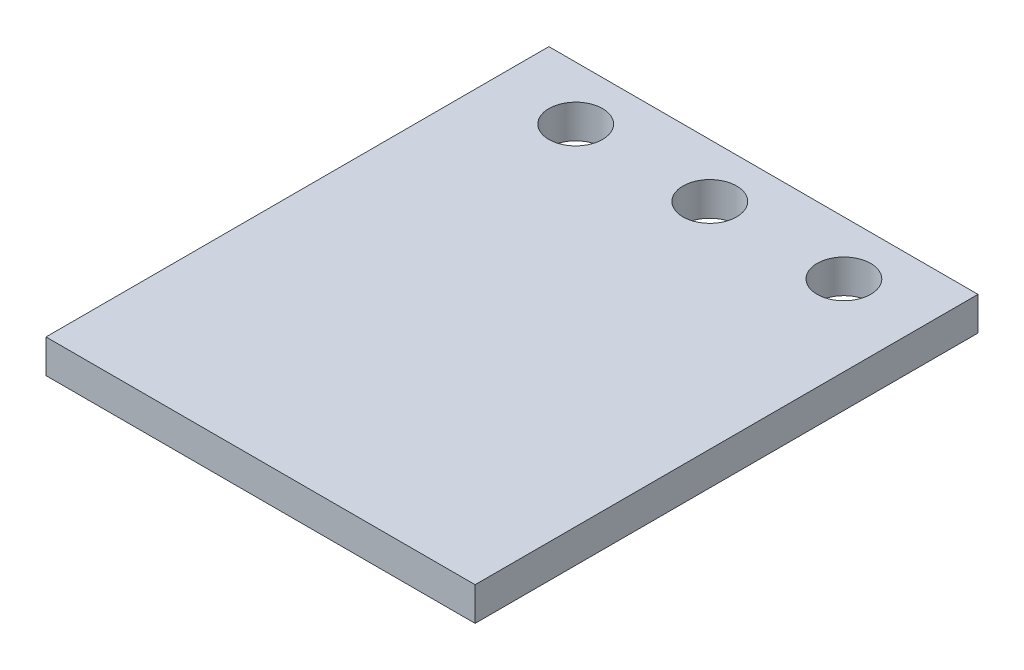
ISO-10303-21;
HEADER;
FILE_DESCRIPTION(('STEP AP214'),'2;1');
FILE_NAME('part.step','',(''),(''),'','','');
FILE_SCHEMA(('AUTOMOTIVE_DESIGN { 1 0 10303 214 1 1 1 1 }'));
ENDSEC;
DATA;
#1=APPLICATION_CONTEXT('core data for automotive mechanical design processes');
#2=APPLICATION_PROTOCOL_DEFINITION('international standard','automotive_design',2000,#1);
#3=PRODUCT_CONTEXT('',#1,'mechanical');
#4=PRODUCT('Part','Part','',(#3));
#5=PRODUCT_RELATED_PRODUCT_CATEGORY('part','',(#4));
#6=PRODUCT_DEFINITION_FORMATION('','',#4);
#7=PRODUCT_DEFINITION_CONTEXT('part definition',#1,'design');
#8=PRODUCT_DEFINITION('design','',#6,#7);
#9=PRODUCT_DEFINITION_SHAPE('','',#8);
#10=(LENGTH_UNIT() NAMED_UNIT(*) SI_UNIT(.MILLI.,.METRE.));
#11=(NAMED_UNIT(*) PLANE_ANGLE_UNIT() SI_UNIT($,.RADIAN.));
#12=(NAMED_UNIT(*) SI_UNIT($,.STERADIAN.) SOLID_ANGLE_UNIT());
#13=UNCERTAINTY_MEASURE_WITH_UNIT(LENGTH_MEASURE(1.E-05),#10,'distance_accuracy_value','');
#14=(GEOMETRIC_REPRESENTATION_CONTEXT(3) GLOBAL_UNCERTAINTY_ASSIGNED_CONTEXT((#13)) GLOBAL_UNIT_ASSIGNED_CONTEXT((#10,
#11,#12)) REPRESENTATION_CONTEXT('',''));
#15=CARTESIAN_POINT('',(0.,0.,0.));
#16=DIRECTION('',(0.,0.,1.));
#17=DIRECTION('',(1.,0.,0.));
#18=AXIS2_PLACEMENT_3D('',#15,#16,#17);
#19=CARTESIAN_POINT('',(-167.754092983453,202.834413861943,-14.9999999999997));
#20=DIRECTION('',(1.,0.,0.));
#21=DIRECTION('',(0.,0.,-1.));
#22=AXIS2_PLACEMENT_3D('',#19,#20,#21);
#23=PLANE('',#22);
#24=DIRECTION('',(0.,1.,0.));
#25=VECTOR('',#24,1.);
#26=CARTESIAN_POINT('',(-167.754092983453,202.834413861943,360.));
#27=LINE('',#26,#25);
#28=CARTESIAN_POINT('',(-167.754092983453,177.834413861943,360.));
#29=VERTEX_POINT('',#28);
#30=CARTESIAN_POINT('',(-167.754092983453,202.834413861943,360.));
#31=VERTEX_POINT('',#30);
#32=EDGE_CURVE('E112',#29,#31,#27,.T.);
#33=ORIENTED_EDGE('',*,*,#32,.T.);
#34=DIRECTION('',(0.,0.,1.));
#35=VECTOR('',#34,1.);
#36=CARTESIAN_POINT('',(-167.754092983453,202.834413861943,-14.9999999999997));
#37=LINE('',#36,#35);
#38=CARTESIAN_POINT('',(-167.754092983453,202.834413861943,-14.9999999999997));
#39=VERTEX_POINT('',#38);
#40=EDGE_CURVE('E13',#39,#31,#37,.T.);
#41=ORIENTED_EDGE('',*,*,#40,.F.);
#42=DIRECTION('',(0.,1.,0.));
#43=VECTOR('',#42,1.);
#44=CARTESIAN_POINT('',(-167.754092983453,202.834413861943,-14.9999999999997));
#45=LINE('',#44,#43);
#46=CARTESIAN_POINT('',(-167.754092983453,177.834413861943,-14.9999999999997));
#47=VERTEX_POINT('',#46);
#48=EDGE_CURVE('E100',#47,#39,#45,.T.);
#49=ORIENTED_EDGE('',*,*,#48,.F.);
#50=DIRECTION('',(0.,0.,1.));
#51=VECTOR('',#50,1.);
#52=CARTESIAN_POINT('',(-167.754092983453,177.834413861943,-14.9999999999997));
#53=LINE('',#52,#51);
#54=EDGE_CURVE('E108',#47,#29,#53,.T.);
#55=ORIENTED_EDGE('',*,*,#54,.T.);
#56=EDGE_LOOP('',(#33,#41,#49,#55));
#57=FACE_BOUND('',#56,.T.);
#58=ADVANCED_FACE('F49',(#57),#23,.F.);
#59=CARTESIAN_POINT('',(152.245907016547,202.834413861943,-14.9999999999997));
#60=DIRECTION('',(0.,-1.,0.));
#61=DIRECTION('',(0.,0.,-1.));
#62=AXIS2_PLACEMENT_3D('',#59,#60,#61);
#63=PLANE('',#62);
#64=CARTESIAN_POINT('',(-107.754092983453,202.834413861943,25.0000000000003));
#65=DIRECTION('',(0.,1.,0.));
#66=DIRECTION('',(0.,0.,1.));
#67=AXIS2_PLACEMENT_3D('',#64,#65,#66);
#68=CIRCLE('',#67,20.);
#69=CARTESIAN_POINT('',(-107.754092983453,202.834413861943,45.0000000000003));
#70=VERTEX_POINT('',#69);
#71=EDGE_CURVE('E136',#70,#70,#68,.T.);
#72=ORIENTED_EDGE('',*,*,#71,.F.);
#73=EDGE_LOOP('',(#72));
#74=FACE_BOUND('',#73,.T.);
#75=CARTESIAN_POINT('',(-7.75409298345258,202.834413861943,25.0000000000003));
#76=DIRECTION('',(0.,1.,0.));
#77=DIRECTION('',(0.,0.,1.));
#78=AXIS2_PLACEMENT_3D('',#75,#76,#77);
#79=CIRCLE('',#78,20.);
#80=CARTESIAN_POINT('',(-7.75409298345258,202.834413861943,45.0000000000003));
#81=VERTEX_POINT('',#80);
#82=EDGE_CURVE('E129',#81,#81,#79,.T.);
#83=ORIENTED_EDGE('',*,*,#82,.F.);
#84=EDGE_LOOP('',(#83));
#85=FACE_BOUND('',#84,.T.);
#86=CARTESIAN_POINT('',(92.2459070165474,202.834413861943,25.0000000000003));
#87=DIRECTION('',(0.,1.,0.));
#88=DIRECTION('',(0.,0.,1.));
#89=AXIS2_PLACEMENT_3D('',#86,#87,#88);
#90=CIRCLE('',#89,20.);
#91=CARTESIAN_POINT('',(92.2459070165474,202.834413861943,45.0000000000003));
#92=VERTEX_POINT('',#91);
#93=EDGE_CURVE('E130',#92,#92,#90,.T.);
#94=ORIENTED_EDGE('',*,*,#93,.F.);
#95=EDGE_LOOP('',(#94));
#96=FACE_BOUND('',#95,.T.);
#97=DIRECTION('',(1.,0.,0.));
#98=VECTOR('',#97,1.);
#99=CARTESIAN_POINT('',(152.245907016547,202.834413861943,360.));
#100=LINE('',#99,#98);
#101=CARTESIAN_POINT('',(152.245907016547,202.834413861943,360.));
#102=VERTEX_POINT('',#101);
#103=EDGE_CURVE('E104',#31,#102,#100,.T.);
#104=ORIENTED_EDGE('',*,*,#103,.T.);
#105=DIRECTION('',(0.,0.,1.));
#106=VECTOR('',#105,1.);
#107=CARTESIAN_POINT('',(152.245907016547,202.834413861943,-14.9999999999997));
#108=LINE('',#107,#106);
#109=CARTESIAN_POINT('',(152.245907016547,202.834413861943,-14.9999999999997));
#110=VERTEX_POINT('',#109);
#111=EDGE_CURVE('E57',#110,#102,#108,.T.);
#112=ORIENTED_EDGE('',*,*,#111,.F.);
#113=DIRECTION('',(1.,0.,0.));
#114=VECTOR('',#113,1.);
#115=CARTESIAN_POINT('',(152.245907016547,202.834413861943,-14.9999999999997));
#116=LINE('',#115,#114);
#117=EDGE_CURVE('E95',#39,#110,#116,.T.);
#118=ORIENTED_EDGE('',*,*,#117,.F.);
#119=ORIENTED_EDGE('',*,*,#40,.T.);
#120=EDGE_LOOP('',(#104,#112,#118,#119));
#121=FACE_BOUND('',#120,.T.);
#122=ADVANCED_FACE('F103',(#74,#85,#96,#121),#63,.F.);
#123=CARTESIAN_POINT('',(152.245907016547,202.834413861943,-14.9999999999997));
#124=DIRECTION('',(-1.,0.,0.));
#125=DIRECTION('',(0.,0.,1.));
#126=AXIS2_PLACEMENT_3D('',#123,#124,#125);
#127=PLANE('',#126);
#128=DIRECTION('',(0.,-1.,0.));
#129=VECTOR('',#128,1.);
#130=CARTESIAN_POINT('',(152.245907016547,202.834413861943,360.));
#131=LINE('',#130,#129);
#132=CARTESIAN_POINT('',(152.245907016547,177.834413861943,360.));
#133=VERTEX_POINT('',#132);
#134=EDGE_CURVE('E82',#102,#133,#131,.T.);
#135=ORIENTED_EDGE('',*,*,#134,.T.);
#136=DIRECTION('',(0.,0.,1.));
#137=VECTOR('',#136,1.);
#138=CARTESIAN_POINT('',(152.245907016547,177.834413861943,-14.9999999999997));
#139=LINE('',#138,#137);
#140=CARTESIAN_POINT('',(152.245907016547,177.834413861943,-14.9999999999997));
#141=VERTEX_POINT('',#140);
#142=EDGE_CURVE('E105',#141,#133,#139,.T.);
#143=ORIENTED_EDGE('',*,*,#142,.F.);
#144=DIRECTION('',(0.,-1.,0.));
#145=VECTOR('',#144,1.);
#146=CARTESIAN_POINT('',(152.245907016547,202.834413861943,-14.9999999999997));
#147=LINE('',#146,#145);
#148=EDGE_CURVE('E98',#110,#141,#147,.T.);
#149=ORIENTED_EDGE('',*,*,#148,.F.);
#150=ORIENTED_EDGE('',*,*,#111,.T.);
#151=EDGE_LOOP('',(#135,#143,#149,#150));
#152=FACE_BOUND('',#151,.T.);
#153=ADVANCED_FACE('F106',(#152),#127,.F.);
#154=CARTESIAN_POINT('',(152.245907016547,177.834413861943,-14.9999999999997));
#155=DIRECTION('',(0.,1.,0.));
#156=DIRECTION('',(0.,0.,1.));
#157=AXIS2_PLACEMENT_3D('',#154,#155,#156);
#158=PLANE('',#157);
#159=CARTESIAN_POINT('',(-107.754092983453,177.834413861943,25.0000000000003));
#160=DIRECTION('',(0.,1.,0.));
#161=DIRECTION('',(0.,0.,1.));
#162=AXIS2_PLACEMENT_3D('',#159,#160,#161);
#163=CIRCLE('',#162,20.);
#164=CARTESIAN_POINT('',(-107.754092983453,177.834413861943,45.0000000000003));
#165=VERTEX_POINT('',#164);
#166=EDGE_CURVE('E115',#165,#165,#163,.F.);
#167=ORIENTED_EDGE('',*,*,#166,.F.);
#168=EDGE_LOOP('',(#167));
#169=FACE_BOUND('',#168,.T.);
#170=CARTESIAN_POINT('',(-7.75409298345258,177.834413861943,25.0000000000003));
#171=DIRECTION('',(0.,1.,0.));
#172=DIRECTION('',(0.,0.,1.));
#173=AXIS2_PLACEMENT_3D('',#170,#171,#172);
#174=CIRCLE('',#173,20.);
#175=CARTESIAN_POINT('',(-7.75409298345258,177.834413861943,45.0000000000003));
#176=VERTEX_POINT('',#175);
#177=EDGE_CURVE('E133',#176,#176,#174,.F.);
#178=ORIENTED_EDGE('',*,*,#177,.F.);
#179=EDGE_LOOP('',(#178));
#180=FACE_BOUND('',#179,.T.);
#181=CARTESIAN_POINT('',(92.2459070165474,177.834413861943,25.0000000000003));
#182=DIRECTION('',(0.,1.,0.));
#183=DIRECTION('',(0.,0.,1.));
#184=AXIS2_PLACEMENT_3D('',#181,#182,#183);
#185=CIRCLE('',#184,20.);
#186=CARTESIAN_POINT('',(92.2459070165474,177.834413861943,45.0000000000003));
#187=VERTEX_POINT('',#186);
#188=EDGE_CURVE('E126',#187,#187,#185,.F.);
#189=ORIENTED_EDGE('',*,*,#188,.F.);
#190=EDGE_LOOP('',(#189));
#191=FACE_BOUND('',#190,.T.);
#192=DIRECTION('',(-1.,0.,0.));
#193=VECTOR('',#192,1.);
#194=CARTESIAN_POINT('',(152.245907016547,177.834413861943,360.));
#195=LINE('',#194,#193);
#196=EDGE_CURVE('E88',#133,#29,#195,.T.);
#197=ORIENTED_EDGE('',*,*,#196,.T.);
#198=ORIENTED_EDGE('',*,*,#54,.F.);
#199=DIRECTION('',(-1.,0.,0.));
#200=VECTOR('',#199,1.);
#201=CARTESIAN_POINT('',(152.245907016547,177.834413861943,-14.9999999999997));
#202=LINE('',#201,#200);
#203=EDGE_CURVE('E65',#141,#47,#202,.T.);
#204=ORIENTED_EDGE('',*,*,#203,.F.);
#205=ORIENTED_EDGE('',*,*,#142,.T.);
#206=EDGE_LOOP('',(#197,#198,#204,#205));
#207=FACE_BOUND('',#206,.T.);
#208=ADVANCED_FACE('F120',(#169,#180,#191,#207),#158,.F.);
#209=CARTESIAN_POINT('',(0.,0.,-14.9999999999997));
#210=DIRECTION('',(0.,0.,-1.));
#211=DIRECTION('',(-1.,0.,0.));
#212=AXIS2_PLACEMENT_3D('',#209,#210,#211);
#213=PLANE('',#212);
#214=ORIENTED_EDGE('',*,*,#48,.T.);
#215=ORIENTED_EDGE('',*,*,#117,.T.);
#216=ORIENTED_EDGE('',*,*,#148,.T.);
#217=ORIENTED_EDGE('',*,*,#203,.T.);
#218=EDGE_LOOP('',(#214,#215,#216,#217));
#219=FACE_BOUND('',#218,.T.);
#220=ADVANCED_FACE('F96',(#219),#213,.T.);
#221=CARTESIAN_POINT('',(0.,0.,360.));
#222=DIRECTION('',(0.,0.,-1.));
#223=DIRECTION('',(-1.,0.,0.));
#224=AXIS2_PLACEMENT_3D('',#221,#222,#223);
#225=PLANE('',#224);
#226=ORIENTED_EDGE('',*,*,#32,.F.);
#227=ORIENTED_EDGE('',*,*,#196,.F.);
#228=ORIENTED_EDGE('',*,*,#134,.F.);
#229=ORIENTED_EDGE('',*,*,#103,.F.);
#230=EDGE_LOOP('',(#226,#227,#228,#229));
#231=FACE_BOUND('',#230,.T.);
#232=ADVANCED_FACE('F123',(#231),#225,.F.);
#233=CARTESIAN_POINT('',(92.2459070165474,177.833413861943,25.0000000000003));
#234=DIRECTION('',(0.,1.,0.));
#235=DIRECTION('',(0.,0.,1.));
#236=AXIS2_PLACEMENT_3D('',#233,#234,#235);
#237=CYLINDRICAL_SURFACE('',#236,20.);
#238=CARTESIAN_POINT('',(92.2459070165474,202.834413861943,45.0000000000003));
#239=CARTESIAN_POINT('',(92.2459070165474,202.573997195277,45.0000000000003));
#240=CARTESIAN_POINT('',(92.2459070165474,202.31358052861,45.0000000000003));
#241=CARTESIAN_POINT('',(92.2459070165474,201.792747195277,45.0000000000003));
#242=CARTESIAN_POINT('',(92.2459070165474,201.53233052861,45.0000000000003));
#243=CARTESIAN_POINT('',(92.2459070165474,201.011497195277,45.0000000000003));
#244=CARTESIAN_POINT('',(92.2459070165474,200.75108052861,45.0000000000003));
#245=CARTESIAN_POINT('',(92.2459070165474,200.230247195277,45.0000000000003));
#246=CARTESIAN_POINT('',(92.2459070165474,199.96983052861,45.0000000000003));
#247=CARTESIAN_POINT('',(92.2459070165474,199.448997195277,45.0000000000003));
#248=CARTESIAN_POINT('',(92.2459070165474,199.18858052861,45.0000000000003));
#249=CARTESIAN_POINT('',(92.2459070165474,198.667747195277,45.0000000000003));
#250=CARTESIAN_POINT('',(92.2459070165474,198.40733052861,45.0000000000003));
#251=CARTESIAN_POINT('',(92.2459070165474,197.886497195277,45.0000000000003));
#252=CARTESIAN_POINT('',(92.2459070165474,197.62608052861,45.0000000000003));
#253=CARTESIAN_POINT('',(92.2459070165474,197.105247195277,45.0000000000003));
#254=CARTESIAN_POINT('',(92.2459070165474,196.84483052861,45.0000000000003));
#255=CARTESIAN_POINT('',(92.2459070165474,196.323997195277,45.0000000000003));
#256=CARTESIAN_POINT('',(92.2459070165474,196.06358052861,45.0000000000003));
#257=CARTESIAN_POINT('',(92.2459070165474,195.542747195277,45.0000000000003));
#258=CARTESIAN_POINT('',(92.2459070165474,195.28233052861,45.0000000000003));
#259=CARTESIAN_POINT('',(92.2459070165474,194.761497195277,45.0000000000003));
#260=CARTESIAN_POINT('',(92.2459070165474,194.50108052861,45.0000000000003));
#261=CARTESIAN_POINT('',(92.2459070165474,193.980247195277,45.0000000000003));
#262=CARTESIAN_POINT('',(92.2459070165474,193.71983052861,45.0000000000003));
#263=CARTESIAN_POINT('',(92.2459070165474,193.198997195277,45.0000000000003));
#264=CARTESIAN_POINT('',(92.2459070165474,192.93858052861,45.0000000000003));
#265=CARTESIAN_POINT('',(92.2459070165474,192.417747195277,45.0000000000003));
#266=CARTESIAN_POINT('',(92.2459070165474,192.15733052861,45.0000000000003));
#267=CARTESIAN_POINT('',(92.2459070165474,191.636497195277,45.0000000000003));
#268=CARTESIAN_POINT('',(92.2459070165474,191.37608052861,45.0000000000003));
#269=CARTESIAN_POINT('',(92.2459070165474,190.855247195277,45.0000000000003));
#270=CARTESIAN_POINT('',(92.2459070165474,190.59483052861,45.0000000000003));
#271=CARTESIAN_POINT('',(92.2459070165474,190.073997195277,45.0000000000003));
#272=CARTESIAN_POINT('',(92.2459070165474,189.81358052861,45.0000000000003));
#273=CARTESIAN_POINT('',(92.2459070165474,189.292747195277,45.0000000000003));
#274=CARTESIAN_POINT('',(92.2459070165474,189.03233052861,45.0000000000003));
#275=CARTESIAN_POINT('',(92.2459070165474,188.511497195277,45.0000000000003));
#276=CARTESIAN_POINT('',(92.2459070165474,188.25108052861,45.0000000000003));
#277=CARTESIAN_POINT('',(92.2459070165474,187.730247195277,45.0000000000003));
#278=CARTESIAN_POINT('',(92.2459070165474,187.46983052861,45.0000000000003));
#279=CARTESIAN_POINT('',(92.2459070165474,186.948997195277,45.0000000000003));
#280=CARTESIAN_POINT('',(92.2459070165474,186.68858052861,45.0000000000003));
#281=CARTESIAN_POINT('',(92.2459070165474,186.167747195277,45.0000000000003));
#282=CARTESIAN_POINT('',(92.2459070165474,185.90733052861,45.0000000000003));
#283=CARTESIAN_POINT('',(92.2459070165474,185.386497195277,45.0000000000003));
#284=CARTESIAN_POINT('',(92.2459070165474,185.12608052861,45.0000000000003));
#285=CARTESIAN_POINT('',(92.2459070165474,184.605247195277,45.0000000000003));
#286=CARTESIAN_POINT('',(92.2459070165474,184.34483052861,45.0000000000003));
#287=CARTESIAN_POINT('',(92.2459070165474,183.823997195277,45.0000000000003));
#288=CARTESIAN_POINT('',(92.2459070165474,183.56358052861,45.0000000000003));
#289=CARTESIAN_POINT('',(92.2459070165474,183.042747195277,45.0000000000003));
#290=CARTESIAN_POINT('',(92.2459070165474,182.78233052861,45.0000000000003));
#291=CARTESIAN_POINT('',(92.2459070165474,182.261497195277,45.0000000000003));
#292=CARTESIAN_POINT('',(92.2459070165474,182.00108052861,45.0000000000003));
#293=CARTESIAN_POINT('',(92.2459070165474,181.480247195277,45.0000000000003));
#294=CARTESIAN_POINT('',(92.2459070165474,181.21983052861,45.0000000000003));
#295=CARTESIAN_POINT('',(92.2459070165474,180.698997195277,45.0000000000003));
#296=CARTESIAN_POINT('',(92.2459070165474,180.43858052861,45.0000000000003));
#297=CARTESIAN_POINT('',(92.2459070165474,179.917747195277,45.0000000000003));
#298=CARTESIAN_POINT('',(92.2459070165474,179.65733052861,45.0000000000003));
#299=CARTESIAN_POINT('',(92.2459070165474,179.136497195277,45.0000000000003));
#300=CARTESIAN_POINT('',(92.2459070165474,178.87608052861,45.0000000000003));
#301=CARTESIAN_POINT('',(92.2459070165474,178.355247195277,45.0000000000003));
#302=CARTESIAN_POINT('',(92.2459070165474,178.09483052861,45.0000000000003));
#303=CARTESIAN_POINT('',(92.2459070165474,177.834413861943,45.0000000000003));
#304=B_SPLINE_CURVE_WITH_KNOTS('',3,(#238,#239,#240,#241,#242,#243,#244,#245,#246,#247,#248,
#249,#250,#251,#252,#253,#254,#255,#256,#257,#258,#259,#260,#261,#262,#263,#264,#265,#266,#267,
#268,#269,#270,#271,#272,#273,#274,#275,#276,#277,#278,#279,#280,#281,#282,#283,#284,#285,#286,
#287,#288,#289,#290,#291,#292,#293,#294,#295,#296,#297,#298,#299,#300,#301,#302,#303),
.UNSPECIFIED.,.F.,.F.,(4,2,2,2,2,2,2,2,2,2,2,2,2,2,2,2,2,2,2,2,2,2,2,2,2,2,2,2,2,2,2,2,4),(0.,
0.781249999999983,1.56249999999999,2.34374999999998,3.12499999999999,3.90625,4.68749999999998,
5.46874999999999,6.24999999999998,7.03124999999999,7.8125,8.59374999999998,9.37499999999999,
10.15625,10.9375,11.71875,12.5,13.28125,14.0625,14.84375,15.625,16.40625,17.1875,17.96875,18.75,
19.53125,20.3125,21.09375,21.875,22.65625,23.4375,24.21875,25.),.UNSPECIFIED.);
#305=EDGE_CURVE('BSEAM153',#92,#187,#304,.T.);
#306=ORIENTED_EDGE('',*,*,#93,.T.);
#307=ORIENTED_EDGE('',*,*,#188,.T.);
#308=ORIENTED_EDGE('',*,*,#305,.T.);
#309=ORIENTED_EDGE('',*,*,#305,.F.);
#310=EDGE_LOOP('',(#306,#308,#307,#309));
#311=FACE_BOUND('',#310,.T.);
#312=ADVANCED_FACE('F153',(#311),#237,.F.);
#313=CARTESIAN_POINT('',(-7.75409298345258,177.833413861943,25.0000000000003));
#314=DIRECTION('',(0.,1.,0.));
#315=DIRECTION('',(0.,0.,1.));
#316=AXIS2_PLACEMENT_3D('',#313,#314,#315);
#317=CYLINDRICAL_SURFACE('',#316,20.);
#318=CARTESIAN_POINT('',(-7.75409298345258,202.834413861943,45.0000000000003));
#319=CARTESIAN_POINT('',(-7.75409298345258,202.573997195277,45.0000000000003));
#320=CARTESIAN_POINT('',(-7.75409298345258,202.31358052861,45.0000000000003));
#321=CARTESIAN_POINT('',(-7.75409298345258,201.792747195277,45.0000000000003));
#322=CARTESIAN_POINT('',(-7.75409298345258,201.53233052861,45.0000000000003));
#323=CARTESIAN_POINT('',(-7.75409298345258,201.011497195277,45.0000000000003));
#324=CARTESIAN_POINT('',(-7.75409298345258,200.75108052861,45.0000000000003));
#325=CARTESIAN_POINT('',(-7.75409298345258,200.230247195277,45.0000000000003));
#326=CARTESIAN_POINT('',(-7.75409298345258,199.96983052861,45.0000000000003));
#327=CARTESIAN_POINT('',(-7.75409298345258,199.448997195277,45.0000000000003));
#328=CARTESIAN_POINT('',(-7.75409298345258,199.18858052861,45.0000000000003));
#329=CARTESIAN_POINT('',(-7.75409298345258,198.667747195277,45.0000000000003));
#330=CARTESIAN_POINT('',(-7.75409298345258,198.40733052861,45.0000000000003));
#331=CARTESIAN_POINT('',(-7.75409298345258,197.886497195277,45.0000000000003));
#332=CARTESIAN_POINT('',(-7.75409298345258,197.62608052861,45.0000000000003));
#333=CARTESIAN_POINT('',(-7.75409298345258,197.105247195277,45.0000000000003));
#334=CARTESIAN_POINT('',(-7.75409298345258,196.84483052861,45.0000000000003));
#335=CARTESIAN_POINT('',(-7.75409298345258,196.323997195277,45.0000000000003));
#336=CARTESIAN_POINT('',(-7.75409298345258,196.06358052861,45.0000000000003));
#337=CARTESIAN_POINT('',(-7.75409298345258,195.542747195277,45.0000000000003));
#338=CARTESIAN_POINT('',(-7.75409298345258,195.28233052861,45.0000000000003));
#339=CARTESIAN_POINT('',(-7.75409298345258,194.761497195277,45.0000000000003));
#340=CARTESIAN_POINT('',(-7.75409298345258,194.50108052861,45.0000000000003));
#341=CARTESIAN_POINT('',(-7.75409298345258,193.980247195277,45.0000000000003));
#342=CARTESIAN_POINT('',(-7.75409298345258,193.71983052861,45.0000000000003));
#343=CARTESIAN_POINT('',(-7.75409298345258,193.198997195277,45.0000000000003));
#344=CARTESIAN_POINT('',(-7.75409298345258,192.93858052861,45.0000000000003));
#345=CARTESIAN_POINT('',(-7.75409298345258,192.417747195277,45.0000000000003));
#346=CARTESIAN_POINT('',(-7.75409298345258,192.15733052861,45.0000000000003));
#347=CARTESIAN_POINT('',(-7.75409298345258,191.636497195277,45.0000000000003));
#348=CARTESIAN_POINT('',(-7.75409298345258,191.37608052861,45.0000000000003));
#349=CARTESIAN_POINT('',(-7.75409298345258,190.855247195277,45.0000000000003));
#350=CARTESIAN_POINT('',(-7.75409298345258,190.59483052861,45.0000000000003));
#351=CARTESIAN_POINT('',(-7.75409298345258,190.073997195277,45.0000000000003));
#352=CARTESIAN_POINT('',(-7.75409298345258,189.81358052861,45.0000000000003));
#353=CARTESIAN_POINT('',(-7.75409298345258,189.292747195277,45.0000000000003));
#354=CARTESIAN_POINT('',(-7.75409298345258,189.03233052861,45.0000000000003));
#355=CARTESIAN_POINT('',(-7.75409298345258,188.511497195277,45.0000000000003));
#356=CARTESIAN_POINT('',(-7.75409298345258,188.25108052861,45.0000000000003));
#357=CARTESIAN_POINT('',(-7.75409298345258,187.730247195277,45.0000000000003));
#358=CARTESIAN_POINT('',(-7.75409298345258,187.46983052861,45.0000000000003));
#359=CARTESIAN_POINT('',(-7.75409298345258,186.948997195277,45.0000000000003));
#360=CARTESIAN_POINT('',(-7.75409298345258,186.68858052861,45.0000000000003));
#361=CARTESIAN_POINT('',(-7.75409298345258,186.167747195277,45.0000000000003));
#362=CARTESIAN_POINT('',(-7.75409298345258,185.90733052861,45.0000000000003));
#363=CARTESIAN_POINT('',(-7.75409298345258,185.386497195277,45.0000000000003));
#364=CARTESIAN_POINT('',(-7.75409298345258,185.12608052861,45.0000000000003));
#365=CARTESIAN_POINT('',(-7.75409298345258,184.605247195277,45.0000000000003));
#366=CARTESIAN_POINT('',(-7.75409298345258,184.34483052861,45.0000000000003));
#367=CARTESIAN_POINT('',(-7.75409298345258,183.823997195277,45.0000000000003));
#368=CARTESIAN_POINT('',(-7.75409298345258,183.56358052861,45.0000000000003));
#369=CARTESIAN_POINT('',(-7.75409298345258,183.042747195277,45.0000000000003));
#370=CARTESIAN_POINT('',(-7.75409298345258,182.78233052861,45.0000000000003));
#371=CARTESIAN_POINT('',(-7.75409298345258,182.261497195277,45.0000000000003));
#372=CARTESIAN_POINT('',(-7.75409298345258,182.00108052861,45.0000000000003));
#373=CARTESIAN_POINT('',(-7.75409298345258,181.480247195277,45.0000000000003));
#374=CARTESIAN_POINT('',(-7.75409298345258,181.21983052861,45.0000000000003));
#375=CARTESIAN_POINT('',(-7.75409298345258,180.698997195277,45.0000000000003));
#376=CARTESIAN_POINT('',(-7.75409298345258,180.43858052861,45.0000000000003));
#377=CARTESIAN_POINT('',(-7.75409298345258,179.917747195277,45.0000000000003));
#378=CARTESIAN_POINT('',(-7.75409298345258,179.65733052861,45.0000000000003));
#379=CARTESIAN_POINT('',(-7.75409298345258,179.136497195277,45.0000000000003));
#380=CARTESIAN_POINT('',(-7.75409298345258,178.87608052861,45.0000000000003));
#381=CARTESIAN_POINT('',(-7.75409298345258,178.355247195277,45.0000000000003));
#382=CARTESIAN_POINT('',(-7.75409298345258,178.09483052861,45.0000000000003));
#383=CARTESIAN_POINT('',(-7.75409298345258,177.834413861943,45.0000000000003));
#384=B_SPLINE_CURVE_WITH_KNOTS('',3,(#318,#319,#320,#321,#322,#323,#324,#325,#326,#327,#328,
#329,#330,#331,#332,#333,#334,#335,#336,#337,#338,#339,#340,#341,#342,#343,#344,#345,#346,#347,
#348,#349,#350,#351,#352,#353,#354,#355,#356,#357,#358,#359,#360,#361,#362,#363,#364,#365,#366,
#367,#368,#369,#370,#371,#372,#373,#374,#375,#376,#377,#378,#379,#380,#381,#382,#383),
.UNSPECIFIED.,.F.,.F.,(4,2,2,2,2,2,2,2,2,2,2,2,2,2,2,2,2,2,2,2,2,2,2,2,2,2,2,2,2,2,2,2,4),(0.,
0.781249999999983,1.56249999999999,2.34374999999998,3.12499999999999,3.90625,4.68749999999998,
5.46874999999999,6.24999999999998,7.03124999999999,7.8125,8.59374999999998,9.37499999999999,
10.15625,10.9375,11.71875,12.5,13.28125,14.0625,14.84375,15.625,16.40625,17.1875,17.96875,18.75,
19.53125,20.3125,21.09375,21.875,22.65625,23.4375,24.21875,25.),.UNSPECIFIED.);
#385=EDGE_CURVE('BSEAM156',#81,#176,#384,.T.);
#386=ORIENTED_EDGE('',*,*,#82,.T.);
#387=ORIENTED_EDGE('',*,*,#177,.T.);
#388=ORIENTED_EDGE('',*,*,#385,.T.);
#389=ORIENTED_EDGE('',*,*,#385,.F.);
#390=EDGE_LOOP('',(#386,#388,#387,#389));
#391=FACE_BOUND('',#390,.T.);
#392=ADVANCED_FACE('F156',(#391),#317,.F.);
#393=CARTESIAN_POINT('',(-107.754092983453,177.833413861943,25.0000000000003));
#394=DIRECTION('',(0.,1.,0.));
#395=DIRECTION('',(0.,0.,1.));
#396=AXIS2_PLACEMENT_3D('',#393,#394,#395);
#397=CYLINDRICAL_SURFACE('',#396,20.);
#398=CARTESIAN_POINT('',(-107.754092983453,202.834413861943,45.0000000000003));
#399=CARTESIAN_POINT('',(-107.754092983453,202.573997195277,45.0000000000003));
#400=CARTESIAN_POINT('',(-107.754092983453,202.31358052861,45.0000000000003));
#401=CARTESIAN_POINT('',(-107.754092983453,201.792747195277,45.0000000000003));
#402=CARTESIAN_POINT('',(-107.754092983453,201.53233052861,45.0000000000003));
#403=CARTESIAN_POINT('',(-107.754092983453,201.011497195277,45.0000000000003));
#404=CARTESIAN_POINT('',(-107.754092983453,200.75108052861,45.0000000000003));
#405=CARTESIAN_POINT('',(-107.754092983453,200.230247195277,45.0000000000003));
#406=CARTESIAN_POINT('',(-107.754092983453,199.96983052861,45.0000000000003));
#407=CARTESIAN_POINT('',(-107.754092983453,199.448997195277,45.0000000000003));
#408=CARTESIAN_POINT('',(-107.754092983453,199.18858052861,45.0000000000003));
#409=CARTESIAN_POINT('',(-107.754092983453,198.667747195277,45.0000000000003));
#410=CARTESIAN_POINT('',(-107.754092983453,198.40733052861,45.0000000000003));
#411=CARTESIAN_POINT('',(-107.754092983453,197.886497195277,45.0000000000003));
#412=CARTESIAN_POINT('',(-107.754092983453,197.62608052861,45.0000000000003));
#413=CARTESIAN_POINT('',(-107.754092983453,197.105247195277,45.0000000000003));
#414=CARTESIAN_POINT('',(-107.754092983453,196.84483052861,45.0000000000003));
#415=CARTESIAN_POINT('',(-107.754092983453,196.323997195277,45.0000000000003));
#416=CARTESIAN_POINT('',(-107.754092983453,196.06358052861,45.0000000000003));
#417=CARTESIAN_POINT('',(-107.754092983453,195.542747195277,45.0000000000003));
#418=CARTESIAN_POINT('',(-107.754092983453,195.28233052861,45.0000000000003));
#419=CARTESIAN_POINT('',(-107.754092983453,194.761497195277,45.0000000000003));
#420=CARTESIAN_POINT('',(-107.754092983453,194.50108052861,45.0000000000003));
#421=CARTESIAN_POINT('',(-107.754092983453,193.980247195277,45.0000000000003));
#422=CARTESIAN_POINT('',(-107.754092983453,193.71983052861,45.0000000000003));
#423=CARTESIAN_POINT('',(-107.754092983453,193.198997195277,45.0000000000003));
#424=CARTESIAN_POINT('',(-107.754092983453,192.93858052861,45.0000000000003));
#425=CARTESIAN_POINT('',(-107.754092983453,192.417747195277,45.0000000000003));
#426=CARTESIAN_POINT('',(-107.754092983453,192.15733052861,45.0000000000003));
#427=CARTESIAN_POINT('',(-107.754092983453,191.636497195277,45.0000000000003));
#428=CARTESIAN_POINT('',(-107.754092983453,191.37608052861,45.0000000000003));
#429=CARTESIAN_POINT('',(-107.754092983453,190.855247195277,45.0000000000003));
#430=CARTESIAN_POINT('',(-107.754092983453,190.59483052861,45.0000000000003));
#431=CARTESIAN_POINT('',(-107.754092983453,190.073997195277,45.0000000000003));
#432=CARTESIAN_POINT('',(-107.754092983453,189.81358052861,45.0000000000003));
#433=CARTESIAN_POINT('',(-107.754092983453,189.292747195277,45.0000000000003));
#434=CARTESIAN_POINT('',(-107.754092983453,189.03233052861,45.0000000000003));
#435=CARTESIAN_POINT('',(-107.754092983453,188.511497195277,45.0000000000003));
#436=CARTESIAN_POINT('',(-107.754092983453,188.25108052861,45.0000000000003));
#437=CARTESIAN_POINT('',(-107.754092983453,187.730247195277,45.0000000000003));
#438=CARTESIAN_POINT('',(-107.754092983453,187.46983052861,45.0000000000003));
#439=CARTESIAN_POINT('',(-107.754092983453,186.948997195277,45.0000000000003));
#440=CARTESIAN_POINT('',(-107.754092983453,186.68858052861,45.0000000000003));
#441=CARTESIAN_POINT('',(-107.754092983453,186.167747195277,45.0000000000003));
#442=CARTESIAN_POINT('',(-107.754092983453,185.90733052861,45.0000000000003));
#443=CARTESIAN_POINT('',(-107.754092983453,185.386497195277,45.0000000000003));
#444=CARTESIAN_POINT('',(-107.754092983453,185.12608052861,45.0000000000003));
#445=CARTESIAN_POINT('',(-107.754092983453,184.605247195277,45.0000000000003));
#446=CARTESIAN_POINT('',(-107.754092983453,184.34483052861,45.0000000000003));
#447=CARTESIAN_POINT('',(-107.754092983453,183.823997195277,45.0000000000003));
#448=CARTESIAN_POINT('',(-107.754092983453,183.56358052861,45.0000000000003));
#449=CARTESIAN_POINT('',(-107.754092983453,183.042747195277,45.0000000000003));
#450=CARTESIAN_POINT('',(-107.754092983453,182.78233052861,45.0000000000003));
#451=CARTESIAN_POINT('',(-107.754092983453,182.261497195277,45.0000000000003));
#452=CARTESIAN_POINT('',(-107.754092983453,182.00108052861,45.0000000000003));
#453=CARTESIAN_POINT('',(-107.754092983453,181.480247195277,45.0000000000003));
#454=CARTESIAN_POINT('',(-107.754092983453,181.21983052861,45.0000000000003));
#455=CARTESIAN_POINT('',(-107.754092983453,180.698997195277,45.0000000000003));
#456=CARTESIAN_POINT('',(-107.754092983453,180.43858052861,45.0000000000003));
#457=CARTESIAN_POINT('',(-107.754092983453,179.917747195277,45.0000000000003));
#458=CARTESIAN_POINT('',(-107.754092983453,179.65733052861,45.0000000000003));
#459=CARTESIAN_POINT('',(-107.754092983453,179.136497195277,45.0000000000003));
#460=CARTESIAN_POINT('',(-107.754092983453,178.87608052861,45.0000000000003));
#461=CARTESIAN_POINT('',(-107.754092983453,178.355247195277,45.0000000000003));
#462=CARTESIAN_POINT('',(-107.754092983453,178.09483052861,45.0000000000003));
#463=CARTESIAN_POINT('',(-107.754092983453,177.834413861943,45.0000000000003));
#464=B_SPLINE_CURVE_WITH_KNOTS('',3,(#398,#399,#400,#401,#402,#403,#404,#405,#406,#407,#408,
#409,#410,#411,#412,#413,#414,#415,#416,#417,#418,#419,#420,#421,#422,#423,#424,#425,#426,#427,
#428,#429,#430,#431,#432,#433,#434,#435,#436,#437,#438,#439,#440,#441,#442,#443,#444,#445,#446,
#447,#448,#449,#450,#451,#452,#453,#454,#455,#456,#457,#458,#459,#460,#461,#462,#463),
.UNSPECIFIED.,.F.,.F.,(4,2,2,2,2,2,2,2,2,2,2,2,2,2,2,2,2,2,2,2,2,2,2,2,2,2,2,2,2,2,2,2,4),(0.,
0.781249999999983,1.56249999999999,2.34374999999998,3.12499999999999,3.90625,4.68749999999998,
5.46874999999999,6.24999999999998,7.03124999999999,7.8125,8.59374999999998,9.37499999999999,
10.15625,10.9375,11.71875,12.5,13.28125,14.0625,14.84375,15.625,16.40625,17.1875,17.96875,18.75,
19.53125,20.3125,21.09375,21.875,22.65625,23.4375,24.21875,25.),.UNSPECIFIED.);
#465=EDGE_CURVE('BSEAM144',#70,#165,#464,.T.);
#466=ORIENTED_EDGE('',*,*,#71,.T.);
#467=ORIENTED_EDGE('',*,*,#166,.T.);
#468=ORIENTED_EDGE('',*,*,#465,.T.);
#469=ORIENTED_EDGE('',*,*,#465,.F.);
#470=EDGE_LOOP('',(#466,#468,#467,#469));
#471=FACE_BOUND('',#470,.T.);
#472=ADVANCED_FACE('F144',(#471),#397,.F.);
#473=CLOSED_SHELL('',(#58,#122,#153,#208,#220,#232,#312,#392,#472));
#474=MANIFOLD_SOLID_BREP('B2',#473);
#475=ADVANCED_BREP_SHAPE_REPRESENTATION('',(#18,#474),#14);
#476=SHAPE_DEFINITION_REPRESENTATION(#9,#475);
ENDSEC;
END-ISO-10303-21;
